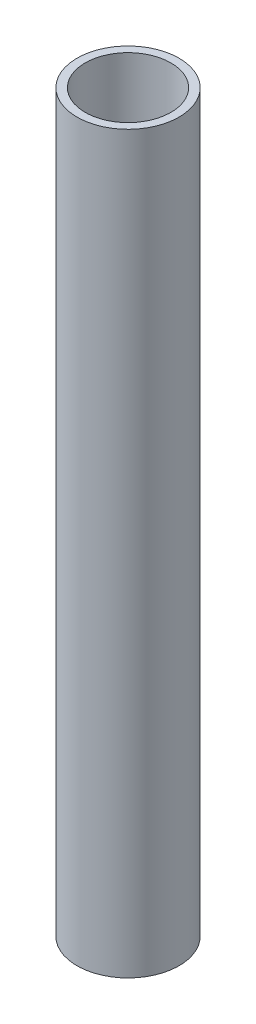
ISO-10303-21;
HEADER;
FILE_DESCRIPTION(('STEP AP214'),'2;1');
FILE_NAME('part.step','',(''),(''),'','','');
FILE_SCHEMA(('AUTOMOTIVE_DESIGN { 1 0 10303 214 1 1 1 1 }'));
ENDSEC;
DATA;
#1=APPLICATION_CONTEXT('core data for automotive mechanical design processes');
#2=APPLICATION_PROTOCOL_DEFINITION('international standard','automotive_design',2000,#1);
#3=PRODUCT_CONTEXT('',#1,'mechanical');
#4=PRODUCT('Part','Part','',(#3));
#5=PRODUCT_RELATED_PRODUCT_CATEGORY('part','',(#4));
#6=PRODUCT_DEFINITION_FORMATION('','',#4);
#7=PRODUCT_DEFINITION_CONTEXT('part definition',#1,'design');
#8=PRODUCT_DEFINITION('design','',#6,#7);
#9=PRODUCT_DEFINITION_SHAPE('','',#8);
#10=(LENGTH_UNIT() NAMED_UNIT(*) SI_UNIT(.MILLI.,.METRE.));
#11=(NAMED_UNIT(*) PLANE_ANGLE_UNIT() SI_UNIT($,.RADIAN.));
#12=(NAMED_UNIT(*) SI_UNIT($,.STERADIAN.) SOLID_ANGLE_UNIT());
#13=UNCERTAINTY_MEASURE_WITH_UNIT(LENGTH_MEASURE(1.E-05),#10,'distance_accuracy_value','');
#14=(GEOMETRIC_REPRESENTATION_CONTEXT(3) GLOBAL_UNCERTAINTY_ASSIGNED_CONTEXT((#13)) GLOBAL_UNIT_ASSIGNED_CONTEXT((#10,
#11,#12)) REPRESENTATION_CONTEXT('',''));
#15=CARTESIAN_POINT('',(0.,0.,0.));
#16=DIRECTION('',(0.,0.,1.));
#17=DIRECTION('',(1.,0.,0.));
#18=AXIS2_PLACEMENT_3D('',#15,#16,#17);
#19=CARTESIAN_POINT('',(0.,180.,0.));
#20=DIRECTION('',(0.,1.,0.));
#21=DIRECTION('',(0.,0.,1.));
#22=AXIS2_PLACEMENT_3D('',#19,#20,#21);
#23=PLANE('',#22);
#24=CARTESIAN_POINT('',(0.,180.,0.));
#25=DIRECTION('',(0.,1.,0.));
#26=DIRECTION('',(0.,0.,1.));
#27=AXIS2_PLACEMENT_3D('',#24,#25,#26);
#28=CIRCLE('',#27,12.5);
#29=CARTESIAN_POINT('',(0.,180.,-12.5));
#30=VERTEX_POINT('',#29);
#31=EDGE_CURVE('E11',#30,#30,#28,.T.);
#32=ORIENTED_EDGE('',*,*,#31,.T.);
#33=EDGE_LOOP('',(#32));
#34=FACE_BOUND('',#33,.T.);
#35=CARTESIAN_POINT('',(0.,180.,0.));
#36=DIRECTION('',(0.,1.,0.));
#37=DIRECTION('',(0.,0.,1.));
#38=AXIS2_PLACEMENT_3D('',#35,#36,#37);
#39=CIRCLE('',#38,10.5);
#40=CARTESIAN_POINT('',(0.,180.,-10.5));
#41=VERTEX_POINT('',#40);
#42=EDGE_CURVE('E49',#41,#41,#39,.T.);
#43=ORIENTED_EDGE('',*,*,#42,.F.);
#44=EDGE_LOOP('',(#43));
#45=FACE_BOUND('',#44,.T.);
#46=ADVANCED_FACE('F38',(#34,#45),#23,.T.);
#47=CARTESIAN_POINT('',(0.,0.,0.));
#48=DIRECTION('',(0.,1.,0.));
#49=DIRECTION('',(0.,0.,1.));
#50=AXIS2_PLACEMENT_3D('',#47,#48,#49);
#51=PLANE('',#50);
#52=CARTESIAN_POINT('',(0.,0.,0.));
#53=DIRECTION('',(0.,1.,0.));
#54=DIRECTION('',(0.,0.,1.));
#55=AXIS2_PLACEMENT_3D('',#52,#53,#54);
#56=CIRCLE('',#55,12.5);
#57=CARTESIAN_POINT('',(0.,0.,-12.5));
#58=VERTEX_POINT('',#57);
#59=EDGE_CURVE('E42',#58,#58,#56,.T.);
#60=ORIENTED_EDGE('',*,*,#59,.F.);
#61=EDGE_LOOP('',(#60));
#62=FACE_BOUND('',#61,.T.);
#63=CARTESIAN_POINT('',(0.,0.,0.));
#64=DIRECTION('',(0.,1.,0.));
#65=DIRECTION('',(0.,0.,1.));
#66=AXIS2_PLACEMENT_3D('',#63,#64,#65);
#67=CIRCLE('',#66,10.5);
#68=CARTESIAN_POINT('',(0.,0.,-10.5));
#69=VERTEX_POINT('',#68);
#70=EDGE_CURVE('E51',#69,#69,#67,.T.);
#71=ORIENTED_EDGE('',*,*,#70,.T.);
#72=EDGE_LOOP('',(#71));
#73=FACE_BOUND('',#72,.T.);
#74=ADVANCED_FACE('F61',(#62,#73),#51,.F.);
#75=CARTESIAN_POINT('',(0.,180.,0.));
#76=DIRECTION('',(0.,-1.,0.));
#77=DIRECTION('',(0.,0.,-1.));
#78=AXIS2_PLACEMENT_3D('',#75,#76,#77);
#79=CYLINDRICAL_SURFACE('',#78,12.5);
#80=CARTESIAN_POINT('',(0.,180.,-12.5));
#81=CARTESIAN_POINT('',(0.,178.125,-12.5));
#82=CARTESIAN_POINT('',(0.,176.25,-12.5));
#83=CARTESIAN_POINT('',(0.,172.5,-12.5));
#84=CARTESIAN_POINT('',(0.,170.625,-12.5));
#85=CARTESIAN_POINT('',(0.,166.875,-12.5));
#86=CARTESIAN_POINT('',(0.,165.,-12.5));
#87=CARTESIAN_POINT('',(0.,161.25,-12.5));
#88=CARTESIAN_POINT('',(0.,159.375,-12.5));
#89=CARTESIAN_POINT('',(0.,155.625,-12.5));
#90=CARTESIAN_POINT('',(0.,153.75,-12.5));
#91=CARTESIAN_POINT('',(0.,150.,-12.5));
#92=CARTESIAN_POINT('',(0.,148.125,-12.5));
#93=CARTESIAN_POINT('',(0.,144.375,-12.5));
#94=CARTESIAN_POINT('',(0.,142.5,-12.5));
#95=CARTESIAN_POINT('',(0.,138.75,-12.5));
#96=CARTESIAN_POINT('',(0.,136.875,-12.5));
#97=CARTESIAN_POINT('',(0.,133.125,-12.5));
#98=CARTESIAN_POINT('',(0.,131.25,-12.5));
#99=CARTESIAN_POINT('',(0.,127.5,-12.5));
#100=CARTESIAN_POINT('',(0.,125.625,-12.5));
#101=CARTESIAN_POINT('',(0.,121.875,-12.5));
#102=CARTESIAN_POINT('',(0.,120.,-12.5));
#103=CARTESIAN_POINT('',(0.,116.25,-12.5));
#104=CARTESIAN_POINT('',(0.,114.375,-12.5));
#105=CARTESIAN_POINT('',(0.,110.625,-12.5));
#106=CARTESIAN_POINT('',(0.,108.75,-12.5));
#107=CARTESIAN_POINT('',(0.,105.,-12.5));
#108=CARTESIAN_POINT('',(0.,103.125,-12.5));
#109=CARTESIAN_POINT('',(0.,99.375,-12.5));
#110=CARTESIAN_POINT('',(0.,97.5,-12.5));
#111=CARTESIAN_POINT('',(0.,93.75,-12.5));
#112=CARTESIAN_POINT('',(0.,91.875,-12.5));
#113=CARTESIAN_POINT('',(0.,88.125,-12.5));
#114=CARTESIAN_POINT('',(0.,86.25,-12.5));
#115=CARTESIAN_POINT('',(0.,82.5,-12.5));
#116=CARTESIAN_POINT('',(0.,80.625,-12.5));
#117=CARTESIAN_POINT('',(0.,76.875,-12.5));
#118=CARTESIAN_POINT('',(0.,75.,-12.5));
#119=CARTESIAN_POINT('',(0.,71.25,-12.5));
#120=CARTESIAN_POINT('',(0.,69.375,-12.5));
#121=CARTESIAN_POINT('',(0.,65.625,-12.5));
#122=CARTESIAN_POINT('',(0.,63.75,-12.5));
#123=CARTESIAN_POINT('',(0.,60.,-12.5));
#124=CARTESIAN_POINT('',(0.,58.125,-12.5));
#125=CARTESIAN_POINT('',(0.,54.375,-12.5));
#126=CARTESIAN_POINT('',(0.,52.5,-12.5));
#127=CARTESIAN_POINT('',(0.,48.75,-12.5));
#128=CARTESIAN_POINT('',(0.,46.875,-12.5));
#129=CARTESIAN_POINT('',(0.,43.125,-12.5));
#130=CARTESIAN_POINT('',(0.,41.25,-12.5));
#131=CARTESIAN_POINT('',(0.,37.5,-12.5));
#132=CARTESIAN_POINT('',(0.,35.625,-12.5));
#133=CARTESIAN_POINT('',(0.,31.875,-12.5));
#134=CARTESIAN_POINT('',(0.,30.,-12.5));
#135=CARTESIAN_POINT('',(0.,26.25,-12.5));
#136=CARTESIAN_POINT('',(0.,24.375,-12.5));
#137=CARTESIAN_POINT('',(0.,20.625,-12.5));
#138=CARTESIAN_POINT('',(0.,18.75,-12.5));
#139=CARTESIAN_POINT('',(0.,15.,-12.5));
#140=CARTESIAN_POINT('',(0.,13.125,-12.5));
#141=CARTESIAN_POINT('',(0.,9.37499999999998,-12.5));
#142=CARTESIAN_POINT('',(0.,7.49999999999997,-12.5));
#143=CARTESIAN_POINT('',(0.,3.74999999999997,-12.5));
#144=CARTESIAN_POINT('',(0.,1.87499999999997,-12.5));
#145=CARTESIAN_POINT('',(0.,0.,-12.5));
#146=B_SPLINE_CURVE_WITH_KNOTS('',3,(#80,#81,#82,#83,#84,#85,#86,#87,#88,#89,#90,#91,#92,#93,
#94,#95,#96,#97,#98,#99,#100,#101,#102,#103,#104,#105,#106,#107,#108,#109,#110,#111,#112,#113,
#114,#115,#116,#117,#118,#119,#120,#121,#122,#123,#124,#125,#126,#127,#128,#129,#130,#131,#132,
#133,#134,#135,#136,#137,#138,#139,#140,#141,#142,#143,#144,#145),.UNSPECIFIED.,.F.,.F.,(4,2,2,
2,2,2,2,2,2,2,2,2,2,2,2,2,2,2,2,2,2,2,2,2,2,2,2,2,2,2,2,2,4),(0.,5.62499999999999,11.25,16.875,
22.5,28.125,33.75,39.375,45.,50.625,56.25,61.875,67.5,73.125,78.75,84.375,90.,95.625,101.25,
106.875,112.5,118.125,123.75,129.375,135.,140.625,146.25,151.875,157.5,163.125,168.75,174.375,
180.),.UNSPECIFIED.);
#147=EDGE_CURVE('BSEAM40',#30,#58,#146,.T.);
#148=ORIENTED_EDGE('',*,*,#31,.F.);
#149=ORIENTED_EDGE('',*,*,#59,.T.);
#150=ORIENTED_EDGE('',*,*,#147,.T.);
#151=ORIENTED_EDGE('',*,*,#147,.F.);
#152=EDGE_LOOP('',(#148,#150,#149,#151));
#153=FACE_BOUND('',#152,.T.);
#154=ADVANCED_FACE('F40',(#153),#79,.T.);
#155=CARTESIAN_POINT('',(0.,180.,0.));
#156=DIRECTION('',(0.,-1.,0.));
#157=DIRECTION('',(0.,0.,-1.));
#158=AXIS2_PLACEMENT_3D('',#155,#156,#157);
#159=CYLINDRICAL_SURFACE('',#158,10.5);
#160=CARTESIAN_POINT('',(0.,180.,-10.5));
#161=CARTESIAN_POINT('',(0.,178.125,-10.5));
#162=CARTESIAN_POINT('',(0.,176.25,-10.5));
#163=CARTESIAN_POINT('',(0.,172.5,-10.5));
#164=CARTESIAN_POINT('',(0.,170.625,-10.5));
#165=CARTESIAN_POINT('',(0.,166.875,-10.5));
#166=CARTESIAN_POINT('',(0.,165.,-10.5));
#167=CARTESIAN_POINT('',(0.,161.25,-10.5));
#168=CARTESIAN_POINT('',(0.,159.375,-10.5));
#169=CARTESIAN_POINT('',(0.,155.625,-10.5));
#170=CARTESIAN_POINT('',(0.,153.75,-10.5));
#171=CARTESIAN_POINT('',(0.,150.,-10.5));
#172=CARTESIAN_POINT('',(0.,148.125,-10.5));
#173=CARTESIAN_POINT('',(0.,144.375,-10.5));
#174=CARTESIAN_POINT('',(0.,142.5,-10.5));
#175=CARTESIAN_POINT('',(0.,138.75,-10.5));
#176=CARTESIAN_POINT('',(0.,136.875,-10.5));
#177=CARTESIAN_POINT('',(0.,133.125,-10.5));
#178=CARTESIAN_POINT('',(0.,131.25,-10.5));
#179=CARTESIAN_POINT('',(0.,127.5,-10.5));
#180=CARTESIAN_POINT('',(0.,125.625,-10.5));
#181=CARTESIAN_POINT('',(0.,121.875,-10.5));
#182=CARTESIAN_POINT('',(0.,120.,-10.5));
#183=CARTESIAN_POINT('',(0.,116.25,-10.5));
#184=CARTESIAN_POINT('',(0.,114.375,-10.5));
#185=CARTESIAN_POINT('',(0.,110.625,-10.5));
#186=CARTESIAN_POINT('',(0.,108.75,-10.5));
#187=CARTESIAN_POINT('',(0.,105.,-10.5));
#188=CARTESIAN_POINT('',(0.,103.125,-10.5));
#189=CARTESIAN_POINT('',(0.,99.375,-10.5));
#190=CARTESIAN_POINT('',(0.,97.5,-10.5));
#191=CARTESIAN_POINT('',(0.,93.75,-10.5));
#192=CARTESIAN_POINT('',(0.,91.875,-10.5));
#193=CARTESIAN_POINT('',(0.,88.125,-10.5));
#194=CARTESIAN_POINT('',(0.,86.25,-10.5));
#195=CARTESIAN_POINT('',(0.,82.5,-10.5));
#196=CARTESIAN_POINT('',(0.,80.625,-10.5));
#197=CARTESIAN_POINT('',(0.,76.875,-10.5));
#198=CARTESIAN_POINT('',(0.,75.,-10.5));
#199=CARTESIAN_POINT('',(0.,71.25,-10.5));
#200=CARTESIAN_POINT('',(0.,69.375,-10.5));
#201=CARTESIAN_POINT('',(0.,65.625,-10.5));
#202=CARTESIAN_POINT('',(0.,63.75,-10.5));
#203=CARTESIAN_POINT('',(0.,60.,-10.5));
#204=CARTESIAN_POINT('',(0.,58.125,-10.5));
#205=CARTESIAN_POINT('',(0.,54.375,-10.5));
#206=CARTESIAN_POINT('',(0.,52.5,-10.5));
#207=CARTESIAN_POINT('',(0.,48.75,-10.5));
#208=CARTESIAN_POINT('',(0.,46.875,-10.5));
#209=CARTESIAN_POINT('',(0.,43.125,-10.5));
#210=CARTESIAN_POINT('',(0.,41.25,-10.5));
#211=CARTESIAN_POINT('',(0.,37.5,-10.5));
#212=CARTESIAN_POINT('',(0.,35.625,-10.5));
#213=CARTESIAN_POINT('',(0.,31.875,-10.5));
#214=CARTESIAN_POINT('',(0.,30.,-10.5));
#215=CARTESIAN_POINT('',(0.,26.25,-10.5));
#216=CARTESIAN_POINT('',(0.,24.375,-10.5));
#217=CARTESIAN_POINT('',(0.,20.625,-10.5));
#218=CARTESIAN_POINT('',(0.,18.75,-10.5));
#219=CARTESIAN_POINT('',(0.,15.,-10.5));
#220=CARTESIAN_POINT('',(0.,13.125,-10.5));
#221=CARTESIAN_POINT('',(0.,9.37499999999998,-10.5));
#222=CARTESIAN_POINT('',(0.,7.49999999999997,-10.5));
#223=CARTESIAN_POINT('',(0.,3.74999999999997,-10.5));
#224=CARTESIAN_POINT('',(0.,1.87499999999997,-10.5));
#225=CARTESIAN_POINT('',(0.,0.,-10.5));
#226=B_SPLINE_CURVE_WITH_KNOTS('',3,(#160,#161,#162,#163,#164,#165,#166,#167,#168,#169,#170,
#171,#172,#173,#174,#175,#176,#177,#178,#179,#180,#181,#182,#183,#184,#185,#186,#187,#188,#189,
#190,#191,#192,#193,#194,#195,#196,#197,#198,#199,#200,#201,#202,#203,#204,#205,#206,#207,#208,
#209,#210,#211,#212,#213,#214,#215,#216,#217,#218,#219,#220,#221,#222,#223,#224,#225),
.UNSPECIFIED.,.F.,.F.,(4,2,2,2,2,2,2,2,2,2,2,2,2,2,2,2,2,2,2,2,2,2,2,2,2,2,2,2,2,2,2,2,4),(0.,
5.62500000000002,11.25,16.875,22.5,28.125,33.75,39.375,45.,50.625,56.25,61.875,67.5,73.125,
78.75,84.375,90.,95.625,101.25,106.875,112.5,118.125,123.75,129.375,135.,140.625,146.25,151.875,
157.5,163.125,168.75,174.375,180.),.UNSPECIFIED.);
#227=EDGE_CURVE('BSEAM57',#41,#69,#226,.T.);
#228=ORIENTED_EDGE('',*,*,#42,.T.);
#229=ORIENTED_EDGE('',*,*,#70,.F.);
#230=ORIENTED_EDGE('',*,*,#227,.T.);
#231=ORIENTED_EDGE('',*,*,#227,.F.);
#232=EDGE_LOOP('',(#228,#230,#229,#231));
#233=FACE_BOUND('',#232,.T.);
#234=ADVANCED_FACE('F57',(#233),#159,.F.);
#235=CLOSED_SHELL('',(#46,#74,#154,#234));
#236=MANIFOLD_SOLID_BREP('B2',#235);
#237=ADVANCED_BREP_SHAPE_REPRESENTATION('',(#18,#236),#14);
#238=SHAPE_DEFINITION_REPRESENTATION(#9,#237);
ENDSEC;
END-ISO-10303-21;
